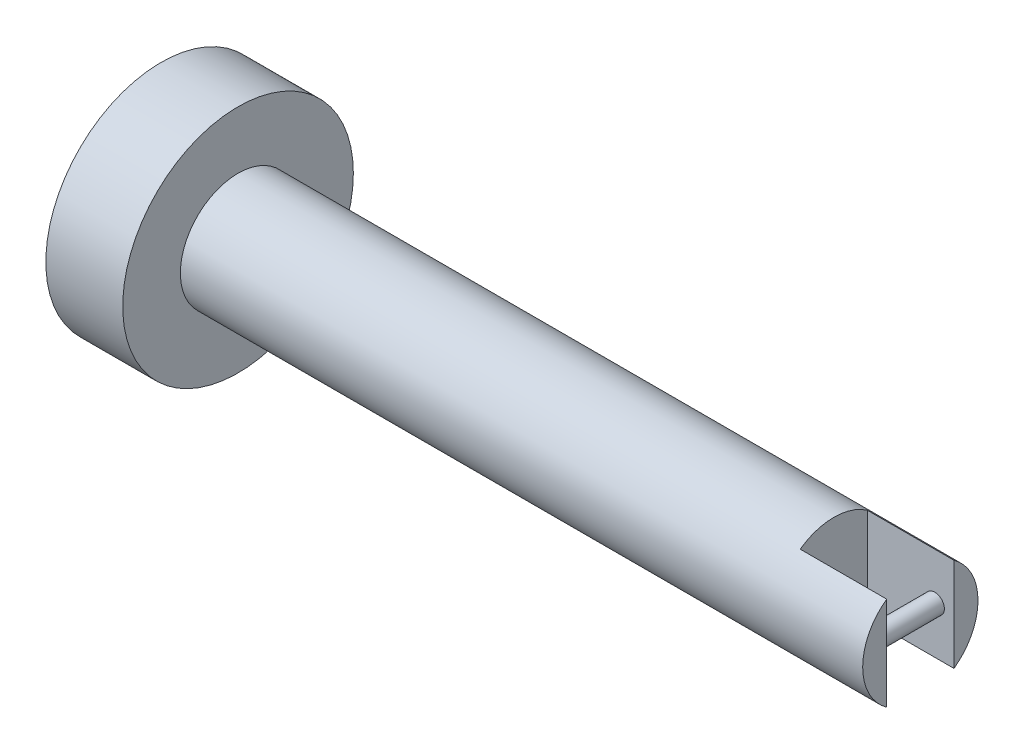
ISO-10303-21;
HEADER;
FILE_DESCRIPTION(('STEP AP214'),'2;1');
FILE_NAME('part.step','',(''),(''),'','','');
FILE_SCHEMA(('AUTOMOTIVE_DESIGN { 1 0 10303 214 1 1 1 1 }'));
ENDSEC;
DATA;
#1=APPLICATION_CONTEXT('core data for automotive mechanical design processes');
#2=APPLICATION_PROTOCOL_DEFINITION('international standard','automotive_design',2000,#1);
#3=PRODUCT_CONTEXT('',#1,'mechanical');
#4=PRODUCT('Part','Part','',(#3));
#5=PRODUCT_RELATED_PRODUCT_CATEGORY('part','',(#4));
#6=PRODUCT_DEFINITION_FORMATION('','',#4);
#7=PRODUCT_DEFINITION_CONTEXT('part definition',#1,'design');
#8=PRODUCT_DEFINITION('design','',#6,#7);
#9=PRODUCT_DEFINITION_SHAPE('','',#8);
#10=(LENGTH_UNIT() NAMED_UNIT(*) SI_UNIT(.MILLI.,.METRE.));
#11=(NAMED_UNIT(*) PLANE_ANGLE_UNIT() SI_UNIT($,.RADIAN.));
#12=(NAMED_UNIT(*) SI_UNIT($,.STERADIAN.) SOLID_ANGLE_UNIT());
#13=UNCERTAINTY_MEASURE_WITH_UNIT(LENGTH_MEASURE(1.E-05),#10,'distance_accuracy_value','');
#14=(GEOMETRIC_REPRESENTATION_CONTEXT(3) GLOBAL_UNCERTAINTY_ASSIGNED_CONTEXT((#13)) GLOBAL_UNIT_ASSIGNED_CONTEXT((#10,
#11,#12)) REPRESENTATION_CONTEXT('',''));
#15=CARTESIAN_POINT('',(0.,0.,0.));
#16=DIRECTION('',(0.,0.,1.));
#17=DIRECTION('',(1.,0.,0.));
#18=AXIS2_PLACEMENT_3D('',#15,#16,#17);
#19=CARTESIAN_POINT('',(395.,0.,0.));
#20=DIRECTION('',(1.,0.,0.));
#21=DIRECTION('',(0.,0.,-1.));
#22=AXIS2_PLACEMENT_3D('',#19,#20,#21);
#23=PLANE('',#22);
#24=DIRECTION('',(0.,-1.,0.));
#25=VECTOR('',#24,1.);
#26=CARTESIAN_POINT('',(395.,0.,17.5));
#27=LINE('',#26,#25);
#28=CARTESIAN_POINT('',(395.,24.3669858620224,17.5));
#29=VERTEX_POINT('',#28);
#30=CARTESIAN_POINT('',(395.,-24.3669858620224,17.5));
#31=VERTEX_POINT('',#30);
#32=EDGE_CURVE('E89',#29,#31,#27,.T.);
#33=ORIENTED_EDGE('',*,*,#32,.F.);
#34=CARTESIAN_POINT('',(395.,0.,0.));
#35=DIRECTION('',(1.,0.,0.));
#36=DIRECTION('',(0.,0.,-1.));
#37=AXIS2_PLACEMENT_3D('',#34,#35,#36);
#38=CIRCLE('',#37,30.);
#39=EDGE_CURVE('E105',#29,#31,#38,.T.);
#40=ORIENTED_EDGE('',*,*,#39,.T.);
#41=EDGE_LOOP('',(#33,#40));
#42=FACE_BOUND('',#41,.T.);
#43=ADVANCED_FACE('F39',(#42),#23,.T.);
#44=CARTESIAN_POINT('',(40.,0.,0.));
#45=DIRECTION('',(-1.,0.,0.));
#46=DIRECTION('',(0.,0.,1.));
#47=AXIS2_PLACEMENT_3D('',#44,#45,#46);
#48=CYLINDRICAL_SURFACE('',#47,60.0000000000001);
#49=CARTESIAN_POINT('',(40.,0.,0.));
#50=DIRECTION('',(1.,0.,0.));
#51=DIRECTION('',(0.,0.,-1.));
#52=AXIS2_PLACEMENT_3D('',#49,#50,#51);
#53=CIRCLE('',#52,60.0000000000001);
#54=CARTESIAN_POINT('',(40.,0.,-60.0000000000001));
#55=VERTEX_POINT('',#54);
#56=EDGE_CURVE('E118',#55,#55,#53,.T.);
#57=ORIENTED_EDGE('',*,*,#56,.F.);
#58=EDGE_LOOP('',(#57));
#59=FACE_BOUND('',#58,.T.);
#60=CARTESIAN_POINT('',(0.,0.,0.));
#61=DIRECTION('',(1.,0.,0.));
#62=DIRECTION('',(0.,0.,-1.));
#63=AXIS2_PLACEMENT_3D('',#60,#61,#62);
#64=CIRCLE('',#63,60.0000000000001);
#65=CARTESIAN_POINT('',(0.,0.,-60.0000000000001));
#66=VERTEX_POINT('',#65);
#67=EDGE_CURVE('E111',#66,#66,#64,.T.);
#68=ORIENTED_EDGE('',*,*,#67,.T.);
#69=EDGE_LOOP('',(#68));
#70=FACE_BOUND('',#69,.T.);
#71=ADVANCED_FACE('F41',(#59,#70),#48,.T.);
#72=CARTESIAN_POINT('',(40.,0.,0.));
#73=DIRECTION('',(1.,0.,0.));
#74=DIRECTION('',(0.,0.,-1.));
#75=AXIS2_PLACEMENT_3D('',#72,#73,#74);
#76=PLANE('',#75);
#77=CARTESIAN_POINT('',(40.,0.,0.));
#78=DIRECTION('',(1.,0.,0.));
#79=DIRECTION('',(0.,0.,-1.));
#80=AXIS2_PLACEMENT_3D('',#77,#78,#79);
#81=CIRCLE('',#80,30.);
#82=CARTESIAN_POINT('',(40.,0.,-30.));
#83=VERTEX_POINT('',#82);
#84=EDGE_CURVE('E90',#83,#83,#81,.T.);
#85=ORIENTED_EDGE('',*,*,#84,.F.);
#86=EDGE_LOOP('',(#85));
#87=FACE_BOUND('',#86,.T.);
#88=ORIENTED_EDGE('',*,*,#56,.T.);
#89=EDGE_LOOP('',(#88));
#90=FACE_BOUND('',#89,.T.);
#91=ADVANCED_FACE('F157',(#87,#90),#76,.T.);
#92=CARTESIAN_POINT('',(0.,0.,0.));
#93=DIRECTION('',(1.,0.,0.));
#94=DIRECTION('',(0.,0.,-1.));
#95=AXIS2_PLACEMENT_3D('',#92,#93,#94);
#96=PLANE('',#95);
#97=ORIENTED_EDGE('',*,*,#67,.F.);
#98=EDGE_LOOP('',(#97));
#99=FACE_BOUND('',#98,.T.);
#100=ADVANCED_FACE('F167',(#99),#96,.F.);
#101=CARTESIAN_POINT('',(395.,0.,0.));
#102=DIRECTION('',(-1.,0.,0.));
#103=DIRECTION('',(0.,0.,1.));
#104=AXIS2_PLACEMENT_3D('',#101,#102,#103);
#105=CYLINDRICAL_SURFACE('',#104,30.);
#106=ORIENTED_EDGE('',*,*,#39,.F.);
#107=DIRECTION('',(-1.,0.,0.));
#108=VECTOR('',#107,1.);
#109=CARTESIAN_POINT('',(395.,24.3669858620224,17.5));
#110=LINE('',#109,#108);
#111=CARTESIAN_POINT('',(350.,24.3669858620224,17.5));
#112=VERTEX_POINT('',#111);
#113=EDGE_CURVE('E106',#29,#112,#110,.T.);
#114=ORIENTED_EDGE('',*,*,#113,.T.);
#115=CARTESIAN_POINT('',(350.,0.,0.));
#116=DIRECTION('',(-1.,0.,0.));
#117=DIRECTION('',(0.,0.,1.));
#118=AXIS2_PLACEMENT_3D('',#115,#116,#117);
#119=CIRCLE('',#118,30.);
#120=CARTESIAN_POINT('',(350.,24.3669858620224,-17.5));
#121=VERTEX_POINT('',#120);
#122=EDGE_CURVE('E99',#112,#121,#119,.T.);
#123=ORIENTED_EDGE('',*,*,#122,.T.);
#124=DIRECTION('',(-1.,0.,0.));
#125=VECTOR('',#124,1.);
#126=CARTESIAN_POINT('',(395.,24.3669858620224,-17.5));
#127=LINE('',#126,#125);
#128=CARTESIAN_POINT('',(395.,24.3669858620224,-17.5));
#129=VERTEX_POINT('',#128);
#130=EDGE_CURVE('E83',#121,#129,#127,.F.);
#131=ORIENTED_EDGE('',*,*,#130,.T.);
#132=CARTESIAN_POINT('',(395.,-24.3669858620224,-17.5));
#133=VERTEX_POINT('',#132);
#134=EDGE_CURVE('E97',#133,#129,#38,.T.);
#135=ORIENTED_EDGE('',*,*,#134,.F.);
#136=DIRECTION('',(-1.,0.,0.));
#137=VECTOR('',#136,1.);
#138=CARTESIAN_POINT('',(395.,-24.3669858620224,-17.5));
#139=LINE('',#138,#137);
#140=CARTESIAN_POINT('',(350.,-24.3669858620224,-17.5));
#141=VERTEX_POINT('',#140);
#142=EDGE_CURVE('E55',#133,#141,#139,.T.);
#143=ORIENTED_EDGE('',*,*,#142,.T.);
#144=CARTESIAN_POINT('',(350.,-24.3669858620224,17.5));
#145=VERTEX_POINT('',#144);
#146=EDGE_CURVE('E127',#141,#145,#119,.T.);
#147=ORIENTED_EDGE('',*,*,#146,.T.);
#148=DIRECTION('',(-1.,0.,0.));
#149=VECTOR('',#148,1.);
#150=CARTESIAN_POINT('',(395.,-24.3669858620224,17.5));
#151=LINE('',#150,#149);
#152=EDGE_CURVE('E63',#145,#31,#151,.F.);
#153=ORIENTED_EDGE('',*,*,#152,.T.);
#154=EDGE_LOOP('',(#106,#114,#123,#131,#135,#143,#147,#153));
#155=FACE_BOUND('',#154,.T.);
#156=ORIENTED_EDGE('',*,*,#84,.T.);
#157=EDGE_LOOP('',(#156));
#158=FACE_BOUND('',#157,.T.);
#159=ADVANCED_FACE('F95',(#155,#158),#105,.T.);
#160=DIRECTION('',(0.,1.,0.));
#161=VECTOR('',#160,1.);
#162=CARTESIAN_POINT('',(395.,0.,-17.5));
#163=LINE('',#162,#161);
#164=EDGE_CURVE('E80',#133,#129,#163,.T.);
#165=ORIENTED_EDGE('',*,*,#164,.F.);
#166=ORIENTED_EDGE('',*,*,#134,.T.);
#167=EDGE_LOOP('',(#165,#166));
#168=FACE_BOUND('',#167,.T.);
#169=ADVANCED_FACE('F103',(#168),#23,.T.);
#170=CARTESIAN_POINT('',(350.,0.,0.));
#171=DIRECTION('',(-1.,0.,0.));
#172=DIRECTION('',(0.,0.,1.));
#173=AXIS2_PLACEMENT_3D('',#170,#171,#172);
#174=PLANE('',#173);
#175=DIRECTION('',(0.,-1.,0.));
#176=VECTOR('',#175,1.);
#177=CARTESIAN_POINT('',(350.,-34.4833811146868,17.5));
#178=LINE('',#177,#176);
#179=EDGE_CURVE('E231',#112,#145,#178,.T.);
#180=ORIENTED_EDGE('',*,*,#179,.T.);
#181=ORIENTED_EDGE('',*,*,#146,.F.);
#182=DIRECTION('',(0.,1.,0.));
#183=VECTOR('',#182,1.);
#184=CARTESIAN_POINT('',(350.,-34.4833811146868,-17.5));
#185=LINE('',#184,#183);
#186=EDGE_CURVE('E101',#141,#121,#185,.T.);
#187=ORIENTED_EDGE('',*,*,#186,.T.);
#188=ORIENTED_EDGE('',*,*,#122,.F.);
#189=EDGE_LOOP('',(#180,#181,#187,#188));
#190=FACE_BOUND('',#189,.T.);
#191=ADVANCED_FACE('F147',(#190),#174,.F.);
#192=CARTESIAN_POINT('',(350.,-34.4833811146868,17.5));
#193=DIRECTION('',(0.,0.,1.));
#194=DIRECTION('',(1.,0.,0.));
#195=AXIS2_PLACEMENT_3D('',#192,#193,#194);
#196=PLANE('',#195);
#197=CARTESIAN_POINT('',(385.,0.,17.5));
#198=DIRECTION('',(0.,0.,1.));
#199=DIRECTION('',(1.,0.,0.));
#200=AXIS2_PLACEMENT_3D('',#197,#198,#199);
#201=CIRCLE('',#200,4.99999999999999);
#202=CARTESIAN_POINT('',(380.,0.,17.5));
#203=VERTEX_POINT('',#202);
#204=EDGE_CURVE('E11',#203,#203,#201,.F.);
#205=ORIENTED_EDGE('',*,*,#204,.F.);
#206=EDGE_LOOP('',(#205));
#207=FACE_BOUND('',#206,.T.);
#208=ORIENTED_EDGE('',*,*,#32,.T.);
#209=ORIENTED_EDGE('',*,*,#152,.F.);
#210=ORIENTED_EDGE('',*,*,#179,.F.);
#211=ORIENTED_EDGE('',*,*,#113,.F.);
#212=EDGE_LOOP('',(#208,#209,#210,#211));
#213=FACE_BOUND('',#212,.T.);
#214=ADVANCED_FACE('F138',(#207,#213),#196,.F.);
#215=CARTESIAN_POINT('',(350.,-34.4833811146868,-17.5));
#216=DIRECTION('',(0.,0.,-1.));
#217=DIRECTION('',(-1.,0.,0.));
#218=AXIS2_PLACEMENT_3D('',#215,#216,#217);
#219=PLANE('',#218);
#220=CARTESIAN_POINT('',(385.,0.,-17.5));
#221=DIRECTION('',(0.,0.,-1.));
#222=DIRECTION('',(-1.,0.,0.));
#223=AXIS2_PLACEMENT_3D('',#220,#221,#222);
#224=CIRCLE('',#223,4.99999999999999);
#225=CARTESIAN_POINT('',(380.,0.,-17.5));
#226=VERTEX_POINT('',#225);
#227=EDGE_CURVE('E48',#226,#226,#224,.F.);
#228=ORIENTED_EDGE('',*,*,#227,.F.);
#229=EDGE_LOOP('',(#228));
#230=FACE_BOUND('',#229,.T.);
#231=ORIENTED_EDGE('',*,*,#164,.T.);
#232=ORIENTED_EDGE('',*,*,#130,.F.);
#233=ORIENTED_EDGE('',*,*,#186,.F.);
#234=ORIENTED_EDGE('',*,*,#142,.F.);
#235=EDGE_LOOP('',(#231,#232,#233,#234));
#236=FACE_BOUND('',#235,.T.);
#237=ADVANCED_FACE('F82',(#230,#236),#219,.F.);
#238=CARTESIAN_POINT('',(385.,0.,17.5));
#239=DIRECTION('',(0.,0.,-1.));
#240=DIRECTION('',(-1.,0.,0.));
#241=AXIS2_PLACEMENT_3D('',#238,#239,#240);
#242=CYLINDRICAL_SURFACE('',#241,4.99999999999999);
#243=CARTESIAN_POINT('',(380.,0.,17.5));
#244=CARTESIAN_POINT('',(380.,0.,17.1354166666667));
#245=CARTESIAN_POINT('',(380.,0.,16.7708333333333));
#246=CARTESIAN_POINT('',(380.,0.,16.0416666666667));
#247=CARTESIAN_POINT('',(380.,0.,15.6770833333333));
#248=CARTESIAN_POINT('',(380.,0.,14.9479166666667));
#249=CARTESIAN_POINT('',(380.,0.,14.5833333333333));
#250=CARTESIAN_POINT('',(380.,0.,13.8541666666667));
#251=CARTESIAN_POINT('',(380.,0.,13.4895833333333));
#252=CARTESIAN_POINT('',(380.,0.,12.7604166666667));
#253=CARTESIAN_POINT('',(380.,0.,12.3958333333333));
#254=CARTESIAN_POINT('',(380.,0.,11.6666666666667));
#255=CARTESIAN_POINT('',(380.,0.,11.3020833333333));
#256=CARTESIAN_POINT('',(380.,0.,10.5729166666667));
#257=CARTESIAN_POINT('',(380.,0.,10.2083333333333));
#258=CARTESIAN_POINT('',(380.,0.,9.47916666666667));
#259=CARTESIAN_POINT('',(380.,0.,9.11458333333333));
#260=CARTESIAN_POINT('',(380.,0.,8.38541666666667));
#261=CARTESIAN_POINT('',(380.,0.,8.02083333333333));
#262=CARTESIAN_POINT('',(380.,0.,7.29166666666667));
#263=CARTESIAN_POINT('',(380.,0.,6.92708333333333));
#264=CARTESIAN_POINT('',(380.,0.,6.19791666666667));
#265=CARTESIAN_POINT('',(380.,0.,5.83333333333333));
#266=CARTESIAN_POINT('',(380.,0.,5.10416666666667));
#267=CARTESIAN_POINT('',(380.,0.,4.73958333333333));
#268=CARTESIAN_POINT('',(380.,0.,4.01041666666666));
#269=CARTESIAN_POINT('',(380.,0.,3.64583333333333));
#270=CARTESIAN_POINT('',(380.,0.,2.91666666666666));
#271=CARTESIAN_POINT('',(380.,0.,2.55208333333333));
#272=CARTESIAN_POINT('',(380.,0.,1.82291666666667));
#273=CARTESIAN_POINT('',(380.,0.,1.45833333333333));
#274=CARTESIAN_POINT('',(380.,0.,0.729166666666667));
#275=CARTESIAN_POINT('',(380.,0.,0.364583333333334));
#276=CARTESIAN_POINT('',(380.,0.,-0.364583333333334));
#277=CARTESIAN_POINT('',(380.,0.,-0.729166666666667));
#278=CARTESIAN_POINT('',(380.,0.,-1.45833333333333));
#279=CARTESIAN_POINT('',(380.,0.,-1.82291666666667));
#280=CARTESIAN_POINT('',(380.,0.,-2.55208333333333));
#281=CARTESIAN_POINT('',(380.,0.,-2.91666666666667));
#282=CARTESIAN_POINT('',(380.,0.,-3.64583333333333));
#283=CARTESIAN_POINT('',(380.,0.,-4.01041666666667));
#284=CARTESIAN_POINT('',(380.,0.,-4.73958333333333));
#285=CARTESIAN_POINT('',(380.,0.,-5.10416666666667));
#286=CARTESIAN_POINT('',(380.,0.,-5.83333333333333));
#287=CARTESIAN_POINT('',(380.,0.,-6.19791666666667));
#288=CARTESIAN_POINT('',(380.,0.,-6.92708333333333));
#289=CARTESIAN_POINT('',(380.,0.,-7.29166666666667));
#290=CARTESIAN_POINT('',(380.,0.,-8.02083333333333));
#291=CARTESIAN_POINT('',(380.,0.,-8.38541666666667));
#292=CARTESIAN_POINT('',(380.,0.,-9.11458333333333));
#293=CARTESIAN_POINT('',(380.,0.,-9.47916666666667));
#294=CARTESIAN_POINT('',(380.,0.,-10.2083333333333));
#295=CARTESIAN_POINT('',(380.,0.,-10.5729166666667));
#296=CARTESIAN_POINT('',(380.,0.,-11.3020833333333));
#297=CARTESIAN_POINT('',(380.,0.,-11.6666666666667));
#298=CARTESIAN_POINT('',(380.,0.,-12.3958333333333));
#299=CARTESIAN_POINT('',(380.,0.,-12.7604166666667));
#300=CARTESIAN_POINT('',(380.,0.,-13.4895833333333));
#301=CARTESIAN_POINT('',(380.,0.,-13.8541666666667));
#302=CARTESIAN_POINT('',(380.,0.,-14.5833333333333));
#303=CARTESIAN_POINT('',(380.,0.,-14.9479166666667));
#304=CARTESIAN_POINT('',(380.,0.,-15.6770833333333));
#305=CARTESIAN_POINT('',(380.,0.,-16.0416666666667));
#306=CARTESIAN_POINT('',(380.,0.,-16.7708333333333));
#307=CARTESIAN_POINT('',(380.,0.,-17.1354166666667));
#308=CARTESIAN_POINT('',(380.,0.,-17.5));
#309=B_SPLINE_CURVE_WITH_KNOTS('',3,(#243,#244,#245,#246,#247,#248,#249,#250,#251,#252,#253,
#254,#255,#256,#257,#258,#259,#260,#261,#262,#263,#264,#265,#266,#267,#268,#269,#270,#271,#272,
#273,#274,#275,#276,#277,#278,#279,#280,#281,#282,#283,#284,#285,#286,#287,#288,#289,#290,#291,
#292,#293,#294,#295,#296,#297,#298,#299,#300,#301,#302,#303,#304,#305,#306,#307,#308),
.UNSPECIFIED.,.F.,.F.,(4,2,2,2,2,2,2,2,2,2,2,2,2,2,2,2,2,2,2,2,2,2,2,2,2,2,2,2,2,2,2,2,4),(0.,
1.09375,2.1875,3.28125,4.375,5.46875,6.5625,7.65625,8.75,9.84375,10.9375,12.03125,13.125,
14.21875,15.3125,16.40625,17.5,18.59375,19.6875,20.78125,21.875,22.96875,24.0625,25.15625,26.25,
27.34375,28.4375,29.53125,30.625,31.71875,32.8125,33.90625,35.),.UNSPECIFIED.);
#310=EDGE_CURVE('BSEAM135',#203,#226,#309,.T.);
#311=ORIENTED_EDGE('',*,*,#204,.T.);
#312=ORIENTED_EDGE('',*,*,#227,.T.);
#313=ORIENTED_EDGE('',*,*,#310,.T.);
#314=ORIENTED_EDGE('',*,*,#310,.F.);
#315=EDGE_LOOP('',(#311,#313,#312,#314));
#316=FACE_BOUND('',#315,.T.);
#317=ADVANCED_FACE('F135',(#316),#242,.T.);
#318=CLOSED_SHELL('',(#43,#71,#91,#100,#159,#169,#191,#214,#237,#317));
#319=MANIFOLD_SOLID_BREP('B2',#318);
#320=ADVANCED_BREP_SHAPE_REPRESENTATION('',(#18,#319),#14);
#321=SHAPE_DEFINITION_REPRESENTATION(#9,#320);
ENDSEC;
END-ISO-10303-21;
